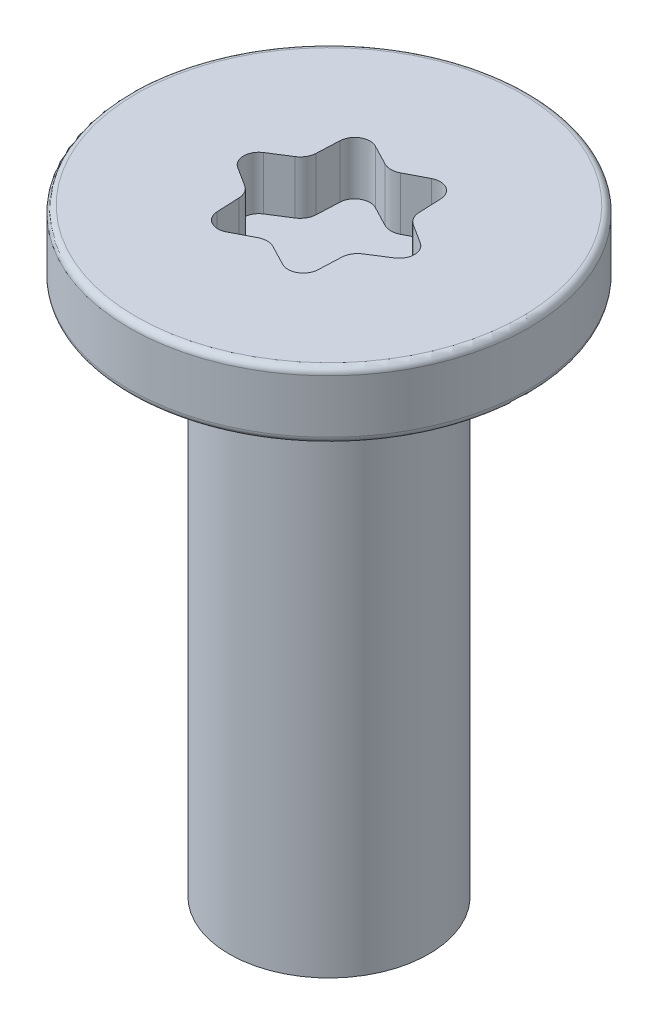
ISO-10303-21;
HEADER;
FILE_DESCRIPTION(('STEP AP214'),'2;1');
FILE_NAME('part.step','',(''),(''),'','','');
FILE_SCHEMA(('AUTOMOTIVE_DESIGN { 1 0 10303 214 1 1 1 1 }'));
ENDSEC;
DATA;
#1=APPLICATION_CONTEXT('core data for automotive mechanical design processes');
#2=APPLICATION_PROTOCOL_DEFINITION('international standard','automotive_design',2000,#1);
#3=PRODUCT_CONTEXT('',#1,'mechanical');
#4=PRODUCT('Part','Part','',(#3));
#5=PRODUCT_RELATED_PRODUCT_CATEGORY('part','',(#4));
#6=PRODUCT_DEFINITION_FORMATION('','',#4);
#7=PRODUCT_DEFINITION_CONTEXT('part definition',#1,'design');
#8=PRODUCT_DEFINITION('design','',#6,#7);
#9=PRODUCT_DEFINITION_SHAPE('','',#8);
#10=(LENGTH_UNIT() NAMED_UNIT(*) SI_UNIT(.MILLI.,.METRE.));
#11=(NAMED_UNIT(*) PLANE_ANGLE_UNIT() SI_UNIT($,.RADIAN.));
#12=(NAMED_UNIT(*) SI_UNIT($,.STERADIAN.) SOLID_ANGLE_UNIT());
#13=UNCERTAINTY_MEASURE_WITH_UNIT(LENGTH_MEASURE(1.E-05),#10,'distance_accuracy_value','');
#14=(GEOMETRIC_REPRESENTATION_CONTEXT(3) GLOBAL_UNCERTAINTY_ASSIGNED_CONTEXT((#13)) GLOBAL_UNIT_ASSIGNED_CONTEXT((#10,
#11,#12)) REPRESENTATION_CONTEXT('',''));
#15=CARTESIAN_POINT('',(0.,0.,0.));
#16=DIRECTION('',(0.,0.,1.));
#17=DIRECTION('',(1.,0.,0.));
#18=AXIS2_PLACEMENT_3D('',#15,#16,#17);
#19=CARTESIAN_POINT('',(0.,0.,-3.));
#20=DIRECTION('',(0.,1.,0.));
#21=DIRECTION('',(0.,0.,1.));
#22=AXIS2_PLACEMENT_3D('',#19,#20,#21);
#23=PLANE('',#22);
#24=DIRECTION('',(0.886771927670818,0.,-0.462207256861012));
#25=VECTOR('',#24,1.);
#26=CARTESIAN_POINT('',(0.368097641561843,0.,0.70621707109422));
#27=LINE('',#26,#25);
#28=CARTESIAN_POINT('',(-0.421192330921968,0.,1.11761434435688));
#29=VERTEX_POINT('',#28);
#30=CARTESIAN_POINT('',(-0.115551814215254,0.,0.958307018082299));
#31=VERTEX_POINT('',#30);
#32=EDGE_CURVE('E56',#29,#31,#27,.T.);
#33=ORIENTED_EDGE('',*,*,#32,.F.);
#34=CARTESIAN_POINT('',(-0.527500000000004,0.,0.913656800992583));
#35=DIRECTION('',(0.,1.,0.));
#36=DIRECTION('',(0.,0.,1.));
#37=AXIS2_PLACEMENT_3D('',#34,#35,#36);
#38=CIRCLE('',#37,0.23);
#39=CARTESIAN_POINT('',(-0.757286248385959,0.,0.923570430636043));
#40=VERTEX_POINT('',#39);
#41=EDGE_CURVE('E306',#29,#40,#38,.F.);
#42=ORIENTED_EDGE('',*,*,#41,.T.);
#43=DIRECTION('',(-0.0431027375802605,0.,-0.999070645156331));
#44=VECTOR('',#43,1.);
#45=CARTESIAN_POINT('',(-0.79565074493476,0.,0.0343266268814208));
#46=LINE('',#45,#44);
#47=CARTESIAN_POINT('',(-0.772142315176557,0.,0.579224315604938));
#48=VERTEX_POINT('',#47);
#49=EDGE_CURVE('E308',#40,#48,#46,.T.);
#50=ORIENTED_EDGE('',*,*,#49,.T.);
#51=CARTESIAN_POINT('',(-1.02190997646564,0.,0.590000000000003));
#52=DIRECTION('',(0.,1.,0.));
#53=DIRECTION('',(0.,0.,1.));
#54=AXIS2_PLACEMENT_3D('',#51,#52,#53);
#55=CIRCLE('',#54,0.25);
#56=CARTESIAN_POINT('',(-0.887694129391809,0.,0.379082702477362));
#57=VERTEX_POINT('',#56);
#58=EDGE_CURVE('E230',#48,#57,#55,.T.);
#59=ORIENTED_EDGE('',*,*,#58,.T.);
#60=DIRECTION('',(0.843669190090564,0.,0.53686338829532));
#61=VECTOR('',#60,1.);
#62=CARTESIAN_POINT('',(-0.427553103372915,0.,0.671890444212806));
#63=LINE('',#62,#61);
#64=CARTESIAN_POINT('',(-1.17847857930793,0.,0.194043913720836));
#65=VERTEX_POINT('',#64);
#66=EDGE_CURVE('E305',#65,#57,#63,.T.);
#67=ORIENTED_EDGE('',*,*,#66,.F.);
#68=CARTESIAN_POINT('',(-1.055,0.,0.));
#69=DIRECTION('',(0.,1.,0.));
#70=DIRECTION('',(0.,0.,1.));
#71=AXIS2_PLACEMENT_3D('',#68,#69,#70);
#72=CIRCLE('',#71,0.23);
#73=CARTESIAN_POINT('',(-1.17847857930792,0.,-0.194043913720829));
#74=VERTEX_POINT('',#73);
#75=EDGE_CURVE('E296',#65,#74,#72,.F.);
#76=ORIENTED_EDGE('',*,*,#75,.T.);
#77=DIRECTION('',(0.843669190090561,0.,-0.536863388295325));
#78=VECTOR('',#77,1.);
#79=CARTESIAN_POINT('',(-0.427553103372918,0.,-0.671890444212802));
#80=LINE('',#79,#78);
#81=CARTESIAN_POINT('',(-0.887694129391808,0.,-0.379082702477357));
#82=VERTEX_POINT('',#81);
#83=EDGE_CURVE('E297',#74,#82,#80,.T.);
#84=ORIENTED_EDGE('',*,*,#83,.T.);
#85=CARTESIAN_POINT('',(-1.02190997646564,0.,-0.589999999999998));
#86=DIRECTION('',(0.,1.,0.));
#87=DIRECTION('',(0.,0.,1.));
#88=AXIS2_PLACEMENT_3D('',#85,#86,#87);
#89=CIRCLE('',#88,0.25);
#90=CARTESIAN_POINT('',(-0.772142315176556,0.,-0.579224315604934));
#91=VERTEX_POINT('',#90);
#92=EDGE_CURVE('E291',#82,#91,#89,.T.);
#93=ORIENTED_EDGE('',*,*,#92,.T.);
#94=DIRECTION('',(-0.0431027375802552,0.,0.999070645156331));
#95=VECTOR('',#94,1.);
#96=CARTESIAN_POINT('',(-0.795650744934757,0.,-0.0343266268814164));
#97=LINE('',#96,#95);
#98=CARTESIAN_POINT('',(-0.757286248385961,0.,-0.923570430636039));
#99=VERTEX_POINT('',#98);
#100=EDGE_CURVE('E287',#99,#91,#97,.T.);
#101=ORIENTED_EDGE('',*,*,#100,.F.);
#102=CARTESIAN_POINT('',(-0.527499999999998,0.,-0.91365680099258));
#103=DIRECTION('',(0.,1.,0.));
#104=DIRECTION('',(0.,0.,1.));
#105=AXIS2_PLACEMENT_3D('',#102,#103,#104);
#106=CIRCLE('',#105,0.23);
#107=CARTESIAN_POINT('',(-0.421192330921967,0.,-1.11761434435687));
#108=VERTEX_POINT('',#107);
#109=EDGE_CURVE('E290',#99,#108,#106,.F.);
#110=ORIENTED_EDGE('',*,*,#109,.T.);
#111=DIRECTION('',(0.886771927670821,0.,0.462207256861006));
#112=VECTOR('',#111,1.);
#113=CARTESIAN_POINT('',(0.368097641561837,0.,-0.70621707109422));
#114=LINE('',#113,#112);
#115=CARTESIAN_POINT('',(-0.115551814215252,0.,-0.958307018082292));
#116=VERTEX_POINT('',#115);
#117=EDGE_CURVE('E281',#108,#116,#114,.T.);
#118=ORIENTED_EDGE('',*,*,#117,.T.);
#119=CARTESIAN_POINT('',(0.,0.,-1.18));
#120=DIRECTION('',(0.,1.,0.));
#121=DIRECTION('',(0.,0.,1.));
#122=AXIS2_PLACEMENT_3D('',#119,#120,#121);
#123=CIRCLE('',#122,0.25);
#124=CARTESIAN_POINT('',(0.115551814215252,0.,-0.958307018082292));
#125=VERTEX_POINT('',#124);
#126=EDGE_CURVE('E282',#116,#125,#123,.T.);
#127=ORIENTED_EDGE('',*,*,#126,.T.);
#128=DIRECTION('',(-0.886771927670819,0.,0.46220725686101));
#129=VECTOR('',#128,1.);
#130=CARTESIAN_POINT('',(-0.36809764156184,0.,-0.706217071094217));
#131=LINE('',#130,#129);
#132=CARTESIAN_POINT('',(0.421192330921965,0.,-1.11761434435687));
#133=VERTEX_POINT('',#132);
#134=EDGE_CURVE('E279',#133,#125,#131,.T.);
#135=ORIENTED_EDGE('',*,*,#134,.F.);
#136=CARTESIAN_POINT('',(0.5275,0.,-0.913656800992577));
#137=DIRECTION('',(0.,1.,0.));
#138=DIRECTION('',(0.,0.,1.));
#139=AXIS2_PLACEMENT_3D('',#136,#137,#138);
#140=CIRCLE('',#139,0.23);
#141=CARTESIAN_POINT('',(0.757286248385956,0.,-0.923570430636036));
#142=VERTEX_POINT('',#141);
#143=EDGE_CURVE('E274',#133,#142,#140,.F.);
#144=ORIENTED_EDGE('',*,*,#143,.T.);
#145=DIRECTION('',(0.0431027375802599,0.,0.999070645156331));
#146=VECTOR('',#145,1.);
#147=CARTESIAN_POINT('',(0.795650744934756,0.,-0.0343266268814201));
#148=LINE('',#147,#146);
#149=CARTESIAN_POINT('',(0.772142315176554,0.,-0.579224315604931));
#150=VERTEX_POINT('',#149);
#151=EDGE_CURVE('E275',#142,#150,#148,.T.);
#152=ORIENTED_EDGE('',*,*,#151,.T.);
#153=CARTESIAN_POINT('',(1.02190997646564,0.,-0.589999999999997));
#154=DIRECTION('',(0.,1.,0.));
#155=DIRECTION('',(0.,0.,1.));
#156=AXIS2_PLACEMENT_3D('',#153,#154,#155);
#157=CIRCLE('',#156,0.25);
#158=CARTESIAN_POINT('',(0.887694129391806,0.,-0.379082702477356));
#159=VERTEX_POINT('',#158);
#160=EDGE_CURVE('E267',#150,#159,#157,.T.);
#161=ORIENTED_EDGE('',*,*,#160,.T.);
#162=DIRECTION('',(-0.843669190090564,0.,-0.53686338829532));
#163=VECTOR('',#162,1.);
#164=CARTESIAN_POINT('',(0.427553103372911,0.,-0.6718904442128));
#165=LINE('',#164,#163);
#166=CARTESIAN_POINT('',(1.17847857930792,0.,-0.194043913720829));
#167=VERTEX_POINT('',#166);
#168=EDGE_CURVE('E266',#167,#159,#165,.T.);
#169=ORIENTED_EDGE('',*,*,#168,.F.);
#170=CARTESIAN_POINT('',(1.055,0.,0.));
#171=DIRECTION('',(0.,1.,0.));
#172=DIRECTION('',(0.,0.,1.));
#173=AXIS2_PLACEMENT_3D('',#170,#171,#172);
#174=CIRCLE('',#173,0.23);
#175=CARTESIAN_POINT('',(1.17847857930792,0.,0.194043913720835));
#176=VERTEX_POINT('',#175);
#177=EDGE_CURVE('E263',#167,#176,#174,.F.);
#178=ORIENTED_EDGE('',*,*,#177,.T.);
#179=DIRECTION('',(-0.843669190090561,0.,0.536863388295325));
#180=VECTOR('',#179,1.);
#181=CARTESIAN_POINT('',(0.42755310337292,0.,0.671890444212805));
#182=LINE('',#181,#180);
#183=CARTESIAN_POINT('',(0.887694129391805,0.,0.379082702477364));
#184=VERTEX_POINT('',#183);
#185=EDGE_CURVE('E257',#176,#184,#182,.T.);
#186=ORIENTED_EDGE('',*,*,#185,.T.);
#187=CARTESIAN_POINT('',(1.02190997646564,0.,0.590000000000004));
#188=DIRECTION('',(0.,1.,0.));
#189=DIRECTION('',(0.,0.,1.));
#190=AXIS2_PLACEMENT_3D('',#187,#188,#189);
#191=CIRCLE('',#190,0.25);
#192=CARTESIAN_POINT('',(0.772142315176553,0.,0.57922431560494));
#193=VERTEX_POINT('',#192);
#194=EDGE_CURVE('E260',#184,#193,#191,.T.);
#195=ORIENTED_EDGE('',*,*,#194,.T.);
#196=DIRECTION('',(0.0431027375802548,0.,-0.999070645156331));
#197=VECTOR('',#196,1.);
#198=CARTESIAN_POINT('',(0.795650744934753,0.,0.034326626881416));
#199=LINE('',#198,#197);
#200=CARTESIAN_POINT('',(0.757286248385957,0.,0.923570430636045));
#201=VERTEX_POINT('',#200);
#202=EDGE_CURVE('E255',#201,#193,#199,.T.);
#203=ORIENTED_EDGE('',*,*,#202,.F.);
#204=CARTESIAN_POINT('',(0.527499999999995,0.,0.913656800992586));
#205=DIRECTION('',(0.,1.,0.));
#206=DIRECTION('',(0.,0.,1.));
#207=AXIS2_PLACEMENT_3D('',#204,#205,#206);
#208=CIRCLE('',#207,0.23);
#209=CARTESIAN_POINT('',(0.421192330921964,0.,1.11761434435687));
#210=VERTEX_POINT('',#209);
#211=EDGE_CURVE('E253',#201,#210,#208,.F.);
#212=ORIENTED_EDGE('',*,*,#211,.T.);
#213=DIRECTION('',(-0.886771927670822,0.,-0.462207256861005));
#214=VECTOR('',#213,1.);
#215=CARTESIAN_POINT('',(-0.36809764156184,0.,0.706217071094227));
#216=LINE('',#215,#214);
#217=CARTESIAN_POINT('',(0.11555181421525,0.,0.958307018082298));
#218=VERTEX_POINT('',#217);
#219=EDGE_CURVE('E246',#210,#218,#216,.T.);
#220=ORIENTED_EDGE('',*,*,#219,.T.);
#221=CARTESIAN_POINT('',(0.,0.,1.18));
#222=DIRECTION('',(0.,1.,0.));
#223=DIRECTION('',(0.,0.,1.));
#224=AXIS2_PLACEMENT_3D('',#221,#222,#223);
#225=CIRCLE('',#224,0.25);
#226=EDGE_CURVE('E243',#218,#31,#225,.T.);
#227=ORIENTED_EDGE('',*,*,#226,.T.);
#228=EDGE_LOOP('',(#33,#42,#50,#59,#67,#76,#84,#93,#101,#110,#118,#127,#135,#144,#152,#161,#169,
#178,#186,#195,#203,#212,#220,#227));
#229=FACE_BOUND('',#228,.T.);
#230=CARTESIAN_POINT('',(0.,0.,0.));
#231=DIRECTION('',(0.,1.,0.));
#232=DIRECTION('',(0.,0.,1.));
#233=AXIS2_PLACEMENT_3D('',#230,#231,#232);
#234=CIRCLE('',#233,2.9);
#235=CARTESIAN_POINT('',(0.,0.,2.9));
#236=VERTEX_POINT('',#235);
#237=EDGE_CURVE('E11',#236,#236,#234,.T.);
#238=ORIENTED_EDGE('',*,*,#237,.T.);
#239=EDGE_LOOP('',(#238));
#240=FACE_BOUND('',#239,.T.);
#241=ADVANCED_FACE('F43',(#229,#240),#23,.T.);
#242=CARTESIAN_POINT('',(0.,-9.,0.));
#243=DIRECTION('',(0.,-1.,0.));
#244=DIRECTION('',(0.,0.,-1.));
#245=AXIS2_PLACEMENT_3D('',#242,#243,#244);
#246=PLANE('',#245);
#247=CARTESIAN_POINT('',(0.,-9.,0.));
#248=DIRECTION('',(0.,-1.,0.));
#249=DIRECTION('',(0.,0.,-1.));
#250=AXIS2_PLACEMENT_3D('',#247,#248,#249);
#251=CIRCLE('',#250,1.5);
#252=CARTESIAN_POINT('',(0.,-9.,-1.5));
#253=VERTEX_POINT('',#252);
#254=EDGE_CURVE('E360',#253,#253,#251,.T.);
#255=ORIENTED_EDGE('',*,*,#254,.T.);
#256=EDGE_LOOP('',(#255));
#257=FACE_BOUND('',#256,.T.);
#258=ADVANCED_FACE('F389',(#257),#246,.T.);
#259=CARTESIAN_POINT('',(0.,0.,0.));
#260=DIRECTION('',(0.,-1.,0.));
#261=DIRECTION('',(0.,0.,-1.));
#262=AXIS2_PLACEMENT_3D('',#259,#260,#261);
#263=CYLINDRICAL_SURFACE('',#262,1.5);
#264=CARTESIAN_POINT('',(0.,-1.,0.));
#265=DIRECTION('',(0.,-1.,0.));
#266=DIRECTION('',(0.,0.,-1.));
#267=AXIS2_PLACEMENT_3D('',#264,#265,#266);
#268=CIRCLE('',#267,1.5);
#269=CARTESIAN_POINT('',(0.,-1.,-1.5));
#270=VERTEX_POINT('',#269);
#271=EDGE_CURVE('E311',#270,#270,#268,.T.);
#272=ORIENTED_EDGE('',*,*,#271,.T.);
#273=EDGE_LOOP('',(#272));
#274=FACE_BOUND('',#273,.T.);
#275=ORIENTED_EDGE('',*,*,#254,.F.);
#276=EDGE_LOOP('',(#275));
#277=FACE_BOUND('',#276,.T.);
#278=ADVANCED_FACE('F385',(#274,#277),#263,.T.);
#279=CARTESIAN_POINT('',(0.,-1.,-1.5));
#280=DIRECTION('',(0.,-1.,0.));
#281=DIRECTION('',(0.,0.,-1.));
#282=AXIS2_PLACEMENT_3D('',#279,#280,#281);
#283=PLANE('',#282);
#284=CARTESIAN_POINT('',(0.,-1.,0.));
#285=DIRECTION('',(0.,-1.,0.));
#286=DIRECTION('',(0.,0.,-1.));
#287=AXIS2_PLACEMENT_3D('',#284,#285,#286);
#288=CIRCLE('',#287,2.9);
#289=CARTESIAN_POINT('',(0.,-1.,-2.9));
#290=VERTEX_POINT('',#289);
#291=EDGE_CURVE('E357',#290,#290,#288,.T.);
#292=ORIENTED_EDGE('',*,*,#291,.T.);
#293=EDGE_LOOP('',(#292));
#294=FACE_BOUND('',#293,.T.);
#295=ORIENTED_EDGE('',*,*,#271,.F.);
#296=EDGE_LOOP('',(#295));
#297=FACE_BOUND('',#296,.T.);
#298=ADVANCED_FACE('F377',(#294,#297),#283,.T.);
#299=CARTESIAN_POINT('',(0.,0.,0.));
#300=DIRECTION('',(0.,-1.,0.));
#301=DIRECTION('',(0.,0.,-1.));
#302=AXIS2_PLACEMENT_3D('',#299,#300,#301);
#303=CYLINDRICAL_SURFACE('',#302,3.);
#304=CARTESIAN_POINT('',(0.,-0.9,0.));
#305=DIRECTION('',(0.,-1.,0.));
#306=DIRECTION('',(0.,0.,-1.));
#307=AXIS2_PLACEMENT_3D('',#304,#305,#306);
#308=CIRCLE('',#307,3.);
#309=CARTESIAN_POINT('',(0.,-0.9,-3.));
#310=VERTEX_POINT('',#309);
#311=EDGE_CURVE('E55',#310,#310,#308,.F.);
#312=ORIENTED_EDGE('',*,*,#311,.T.);
#313=EDGE_LOOP('',(#312));
#314=FACE_BOUND('',#313,.T.);
#315=CARTESIAN_POINT('',(0.,-0.1,0.));
#316=DIRECTION('',(0.,1.,0.));
#317=DIRECTION('',(0.,0.,1.));
#318=AXIS2_PLACEMENT_3D('',#315,#316,#317);
#319=CIRCLE('',#318,3.);
#320=CARTESIAN_POINT('',(0.,-0.1,3.));
#321=VERTEX_POINT('',#320);
#322=EDGE_CURVE('E365',#321,#321,#319,.F.);
#323=ORIENTED_EDGE('',*,*,#322,.T.);
#324=EDGE_LOOP('',(#323));
#325=FACE_BOUND('',#324,.T.);
#326=ADVANCED_FACE('F371',(#314,#325),#303,.T.);
#327=CARTESIAN_POINT('',(0.,-0.9,0.));
#328=DIRECTION('',(0.,-1.,0.));
#329=DIRECTION('',(0.,0.,-1.));
#330=AXIS2_PLACEMENT_3D('',#327,#328,#329);
#331=TOROIDAL_SURFACE('',#330,2.9,0.1);
#332=ORIENTED_EDGE('',*,*,#311,.F.);
#333=EDGE_LOOP('',(#332));
#334=FACE_BOUND('',#333,.T.);
#335=ORIENTED_EDGE('',*,*,#291,.F.);
#336=EDGE_LOOP('',(#335));
#337=FACE_BOUND('',#336,.T.);
#338=ADVANCED_FACE('F372',(#334,#337),#331,.T.);
#339=CARTESIAN_POINT('',(0.,-0.1,0.));
#340=DIRECTION('',(0.,1.,0.));
#341=DIRECTION('',(0.,0.,1.));
#342=AXIS2_PLACEMENT_3D('',#339,#340,#341);
#343=TOROIDAL_SURFACE('',#342,2.9,0.1);
#344=ORIENTED_EDGE('',*,*,#237,.F.);
#345=EDGE_LOOP('',(#344));
#346=FACE_BOUND('',#345,.T.);
#347=ORIENTED_EDGE('',*,*,#322,.F.);
#348=EDGE_LOOP('',(#347));
#349=FACE_BOUND('',#348,.T.);
#350=ADVANCED_FACE('F44',(#346,#349),#343,.T.);
#351=CARTESIAN_POINT('',(0.368097641561843,-0.8,0.70621707109422));
#352=DIRECTION('',(0.462207256861011,0.,0.886771927670818));
#353=DIRECTION('',(0.886771927670818,0.,-0.462207256861011));
#354=AXIS2_PLACEMENT_3D('',#351,#352,#353);
#355=PLANE('',#354);
#356=ORIENTED_EDGE('',*,*,#32,.T.);
#357=DIRECTION('',(0.,1.,0.));
#358=VECTOR('',#357,1.);
#359=CARTESIAN_POINT('',(-0.115551814215254,-0.8,0.958307018082299));
#360=LINE('',#359,#358);
#361=CARTESIAN_POINT('',(-0.115551814215254,-0.8,0.958307018082299));
#362=VERTEX_POINT('',#361);
#363=EDGE_CURVE('E244',#362,#31,#360,.T.);
#364=ORIENTED_EDGE('',*,*,#363,.F.);
#365=DIRECTION('',(0.886771927670818,0.,-0.462207256861012));
#366=VECTOR('',#365,1.);
#367=CARTESIAN_POINT('',(0.368097641561843,-0.8,0.70621707109422));
#368=LINE('',#367,#366);
#369=CARTESIAN_POINT('',(-0.421192330921968,-0.8,1.11761434435688));
#370=VERTEX_POINT('',#369);
#371=EDGE_CURVE('E313',#370,#362,#368,.T.);
#372=ORIENTED_EDGE('',*,*,#371,.F.);
#373=DIRECTION('',(0.,1.,0.));
#374=VECTOR('',#373,1.);
#375=CARTESIAN_POINT('',(-0.421192330921968,-0.8,1.11761434435688));
#376=LINE('',#375,#374);
#377=EDGE_CURVE('E70',#370,#29,#376,.T.);
#378=ORIENTED_EDGE('',*,*,#377,.T.);
#379=EDGE_LOOP('',(#356,#364,#372,#378));
#380=FACE_BOUND('',#379,.T.);
#381=ADVANCED_FACE('F405',(#380),#355,.F.);
#382=CARTESIAN_POINT('',(-0.527500000000004,-0.8,0.913656800992583));
#383=DIRECTION('',(0.,1.,0.));
#384=DIRECTION('',(0.,0.,1.));
#385=AXIS2_PLACEMENT_3D('',#382,#383,#384);
#386=CYLINDRICAL_SURFACE('',#385,0.23);
#387=ORIENTED_EDGE('',*,*,#41,.F.);
#388=ORIENTED_EDGE('',*,*,#377,.F.);
#389=CARTESIAN_POINT('',(-0.527500000000004,-0.8,0.913656800992583));
#390=DIRECTION('',(0.,1.,0.));
#391=DIRECTION('',(0.,0.,1.));
#392=AXIS2_PLACEMENT_3D('',#389,#390,#391);
#393=CIRCLE('',#392,0.23);
#394=CARTESIAN_POINT('',(-0.757286248385959,-0.8,0.923570430636043));
#395=VERTEX_POINT('',#394);
#396=EDGE_CURVE('E219',#370,#395,#393,.F.);
#397=ORIENTED_EDGE('',*,*,#396,.T.);
#398=DIRECTION('',(0.,1.,0.));
#399=VECTOR('',#398,1.);
#400=CARTESIAN_POINT('',(-0.757286248385959,-0.8,0.923570430636043));
#401=LINE('',#400,#399);
#402=EDGE_CURVE('E220',#395,#40,#401,.T.);
#403=ORIENTED_EDGE('',*,*,#402,.T.);
#404=EDGE_LOOP('',(#387,#388,#397,#403));
#405=FACE_BOUND('',#404,.T.);
#406=ADVANCED_FACE('F403',(#405),#386,.F.);
#407=CARTESIAN_POINT('',(-0.79565074493476,-0.8,0.0343266268814208));
#408=DIRECTION('',(0.999070645156331,0.,-0.0431027375802605));
#409=DIRECTION('',(-0.0431027375802605,0.,-0.999070645156331));
#410=AXIS2_PLACEMENT_3D('',#407,#408,#409);
#411=PLANE('',#410);
#412=ORIENTED_EDGE('',*,*,#49,.F.);
#413=ORIENTED_EDGE('',*,*,#402,.F.);
#414=DIRECTION('',(-0.0431027375802605,0.,-0.999070645156331));
#415=VECTOR('',#414,1.);
#416=CARTESIAN_POINT('',(-0.79565074493476,-0.8,0.0343266268814208));
#417=LINE('',#416,#415);
#418=CARTESIAN_POINT('',(-0.772142315176557,-0.8,0.579224315604938));
#419=VERTEX_POINT('',#418);
#420=EDGE_CURVE('E211',#395,#419,#417,.T.);
#421=ORIENTED_EDGE('',*,*,#420,.T.);
#422=DIRECTION('',(0.,1.,0.));
#423=VECTOR('',#422,1.);
#424=CARTESIAN_POINT('',(-0.772142315176557,-0.8,0.579224315604938));
#425=LINE('',#424,#423);
#426=EDGE_CURVE('E214',#419,#48,#425,.T.);
#427=ORIENTED_EDGE('',*,*,#426,.T.);
#428=EDGE_LOOP('',(#412,#413,#421,#427));
#429=FACE_BOUND('',#428,.T.);
#430=ADVANCED_FACE('F212',(#429),#411,.T.);
#431=CARTESIAN_POINT('',(-1.02190997646564,-0.8,0.590000000000003));
#432=DIRECTION('',(0.,1.,0.));
#433=DIRECTION('',(0.,0.,1.));
#434=AXIS2_PLACEMENT_3D('',#431,#432,#433);
#435=CYLINDRICAL_SURFACE('',#434,0.25);
#436=ORIENTED_EDGE('',*,*,#58,.F.);
#437=ORIENTED_EDGE('',*,*,#426,.F.);
#438=CARTESIAN_POINT('',(-1.02190997646564,-0.8,0.590000000000003));
#439=DIRECTION('',(0.,1.,0.));
#440=DIRECTION('',(0.,0.,1.));
#441=AXIS2_PLACEMENT_3D('',#438,#439,#440);
#442=CIRCLE('',#441,0.25);
#443=CARTESIAN_POINT('',(-0.887694129391809,-0.8,0.379082702477362));
#444=VERTEX_POINT('',#443);
#445=EDGE_CURVE('E222',#419,#444,#442,.T.);
#446=ORIENTED_EDGE('',*,*,#445,.T.);
#447=DIRECTION('',(0.,1.,0.));
#448=VECTOR('',#447,1.);
#449=CARTESIAN_POINT('',(-0.887694129391809,-0.8,0.379082702477362));
#450=LINE('',#449,#448);
#451=EDGE_CURVE('E226',#444,#57,#450,.T.);
#452=ORIENTED_EDGE('',*,*,#451,.T.);
#453=EDGE_LOOP('',(#436,#437,#446,#452));
#454=FACE_BOUND('',#453,.T.);
#455=ADVANCED_FACE('F221',(#454),#435,.T.);
#456=CARTESIAN_POINT('',(-0.427553103372915,-0.8,0.671890444212806));
#457=DIRECTION('',(-0.53686338829532,0.,0.843669190090565));
#458=DIRECTION('',(0.843669190090565,0.,0.53686338829532));
#459=AXIS2_PLACEMENT_3D('',#456,#457,#458);
#460=PLANE('',#459);
#461=ORIENTED_EDGE('',*,*,#66,.T.);
#462=ORIENTED_EDGE('',*,*,#451,.F.);
#463=DIRECTION('',(0.843669190090564,0.,0.53686338829532));
#464=VECTOR('',#463,1.);
#465=CARTESIAN_POINT('',(-0.427553103372915,-0.8,0.671890444212806));
#466=LINE('',#465,#464);
#467=CARTESIAN_POINT('',(-1.17847857930793,-0.8,0.194043913720836));
#468=VERTEX_POINT('',#467);
#469=EDGE_CURVE('E237',#468,#444,#466,.T.);
#470=ORIENTED_EDGE('',*,*,#469,.F.);
#471=DIRECTION('',(0.,1.,0.));
#472=VECTOR('',#471,1.);
#473=CARTESIAN_POINT('',(-1.17847857930793,-0.8,0.194043913720836));
#474=LINE('',#473,#472);
#475=EDGE_CURVE('E316',#468,#65,#474,.T.);
#476=ORIENTED_EDGE('',*,*,#475,.T.);
#477=EDGE_LOOP('',(#461,#462,#470,#476));
#478=FACE_BOUND('',#477,.T.);
#479=ADVANCED_FACE('F477',(#478),#460,.F.);
#480=CARTESIAN_POINT('',(-1.055,-0.8,0.));
#481=DIRECTION('',(0.,1.,0.));
#482=DIRECTION('',(0.,0.,1.));
#483=AXIS2_PLACEMENT_3D('',#480,#481,#482);
#484=CYLINDRICAL_SURFACE('',#483,0.23);
#485=ORIENTED_EDGE('',*,*,#75,.F.);
#486=ORIENTED_EDGE('',*,*,#475,.F.);
#487=CARTESIAN_POINT('',(-1.055,-0.8,0.));
#488=DIRECTION('',(0.,1.,0.));
#489=DIRECTION('',(0.,0.,1.));
#490=AXIS2_PLACEMENT_3D('',#487,#488,#489);
#491=CIRCLE('',#490,0.23);
#492=CARTESIAN_POINT('',(-1.17847857930792,-0.8,-0.194043913720829));
#493=VERTEX_POINT('',#492);
#494=EDGE_CURVE('E236',#468,#493,#491,.F.);
#495=ORIENTED_EDGE('',*,*,#494,.T.);
#496=DIRECTION('',(0.,1.,0.));
#497=VECTOR('',#496,1.);
#498=CARTESIAN_POINT('',(-1.17847857930792,-0.8,-0.194043913720829));
#499=LINE('',#498,#497);
#500=EDGE_CURVE('E318',#493,#74,#499,.T.);
#501=ORIENTED_EDGE('',*,*,#500,.T.);
#502=EDGE_LOOP('',(#485,#486,#495,#501));
#503=FACE_BOUND('',#502,.T.);
#504=ADVANCED_FACE('F478',(#503),#484,.F.);
#505=CARTESIAN_POINT('',(-0.427553103372918,-0.8,-0.671890444212802));
#506=DIRECTION('',(0.536863388295325,0.,0.843669190090561));
#507=DIRECTION('',(0.843669190090561,0.,-0.536863388295325));
#508=AXIS2_PLACEMENT_3D('',#505,#506,#507);
#509=PLANE('',#508);
#510=ORIENTED_EDGE('',*,*,#83,.F.);
#511=ORIENTED_EDGE('',*,*,#500,.F.);
#512=DIRECTION('',(0.843669190090561,0.,-0.536863388295325));
#513=VECTOR('',#512,1.);
#514=CARTESIAN_POINT('',(-0.427553103372918,-0.8,-0.671890444212802));
#515=LINE('',#514,#513);
#516=CARTESIAN_POINT('',(-0.887694129391808,-0.8,-0.379082702477357));
#517=VERTEX_POINT('',#516);
#518=EDGE_CURVE('E766',#493,#517,#515,.T.);
#519=ORIENTED_EDGE('',*,*,#518,.T.);
#520=DIRECTION('',(0.,1.,0.));
#521=VECTOR('',#520,1.);
#522=CARTESIAN_POINT('',(-0.887694129391808,-0.8,-0.379082702477357));
#523=LINE('',#522,#521);
#524=EDGE_CURVE('E319',#517,#82,#523,.T.);
#525=ORIENTED_EDGE('',*,*,#524,.T.);
#526=EDGE_LOOP('',(#510,#511,#519,#525));
#527=FACE_BOUND('',#526,.T.);
#528=ADVANCED_FACE('F472',(#527),#509,.T.);
#529=CARTESIAN_POINT('',(-1.02190997646564,-0.8,-0.589999999999998));
#530=DIRECTION('',(0.,1.,0.));
#531=DIRECTION('',(0.,0.,1.));
#532=AXIS2_PLACEMENT_3D('',#529,#530,#531);
#533=CYLINDRICAL_SURFACE('',#532,0.25);
#534=ORIENTED_EDGE('',*,*,#92,.F.);
#535=ORIENTED_EDGE('',*,*,#524,.F.);
#536=CARTESIAN_POINT('',(-1.02190997646564,-0.8,-0.589999999999998));
#537=DIRECTION('',(0.,1.,0.));
#538=DIRECTION('',(0.,0.,1.));
#539=AXIS2_PLACEMENT_3D('',#536,#537,#538);
#540=CIRCLE('',#539,0.25);
#541=CARTESIAN_POINT('',(-0.772142315176556,-0.8,-0.579224315604934));
#542=VERTEX_POINT('',#541);
#543=EDGE_CURVE('E762',#517,#542,#540,.T.);
#544=ORIENTED_EDGE('',*,*,#543,.T.);
#545=DIRECTION('',(0.,1.,0.));
#546=VECTOR('',#545,1.);
#547=CARTESIAN_POINT('',(-0.772142315176556,-0.8,-0.579224315604934));
#548=LINE('',#547,#546);
#549=EDGE_CURVE('E325',#542,#91,#548,.T.);
#550=ORIENTED_EDGE('',*,*,#549,.T.);
#551=EDGE_LOOP('',(#534,#535,#544,#550));
#552=FACE_BOUND('',#551,.T.);
#553=ADVANCED_FACE('F466',(#552),#533,.T.);
#554=CARTESIAN_POINT('',(-0.795650744934757,-0.8,-0.0343266268814164));
#555=DIRECTION('',(-0.999070645156331,0.,-0.0431027375802552));
#556=DIRECTION('',(-0.0431027375802552,0.,0.999070645156331));
#557=AXIS2_PLACEMENT_3D('',#554,#555,#556);
#558=PLANE('',#557);
#559=ORIENTED_EDGE('',*,*,#100,.T.);
#560=ORIENTED_EDGE('',*,*,#549,.F.);
#561=DIRECTION('',(-0.0431027375802552,0.,0.999070645156331));
#562=VECTOR('',#561,1.);
#563=CARTESIAN_POINT('',(-0.795650744934757,-0.8,-0.0343266268814164));
#564=LINE('',#563,#562);
#565=CARTESIAN_POINT('',(-0.757286248385961,-0.8,-0.923570430636039));
#566=VERTEX_POINT('',#565);
#567=EDGE_CURVE('E761',#566,#542,#564,.T.);
#568=ORIENTED_EDGE('',*,*,#567,.F.);
#569=DIRECTION('',(0.,1.,0.));
#570=VECTOR('',#569,1.);
#571=CARTESIAN_POINT('',(-0.757286248385961,-0.8,-0.923570430636039));
#572=LINE('',#571,#570);
#573=EDGE_CURVE('E322',#566,#99,#572,.T.);
#574=ORIENTED_EDGE('',*,*,#573,.T.);
#575=EDGE_LOOP('',(#559,#560,#568,#574));
#576=FACE_BOUND('',#575,.T.);
#577=ADVANCED_FACE('F461',(#576),#558,.F.);
#578=CARTESIAN_POINT('',(-0.527499999999998,-0.8,-0.91365680099258));
#579=DIRECTION('',(0.,1.,0.));
#580=DIRECTION('',(0.,0.,1.));
#581=AXIS2_PLACEMENT_3D('',#578,#579,#580);
#582=CYLINDRICAL_SURFACE('',#581,0.23);
#583=ORIENTED_EDGE('',*,*,#109,.F.);
#584=ORIENTED_EDGE('',*,*,#573,.F.);
#585=CARTESIAN_POINT('',(-0.527499999999998,-0.8,-0.91365680099258));
#586=DIRECTION('',(0.,1.,0.));
#587=DIRECTION('',(0.,0.,1.));
#588=AXIS2_PLACEMENT_3D('',#585,#586,#587);
#589=CIRCLE('',#588,0.23);
#590=CARTESIAN_POINT('',(-0.421192330921967,-0.8,-1.11761434435687));
#591=VERTEX_POINT('',#590);
#592=EDGE_CURVE('E757',#566,#591,#589,.F.);
#593=ORIENTED_EDGE('',*,*,#592,.T.);
#594=DIRECTION('',(0.,1.,0.));
#595=VECTOR('',#594,1.);
#596=CARTESIAN_POINT('',(-0.421192330921967,-0.8,-1.11761434435687));
#597=LINE('',#596,#595);
#598=EDGE_CURVE('E326',#591,#108,#597,.T.);
#599=ORIENTED_EDGE('',*,*,#598,.T.);
#600=EDGE_LOOP('',(#583,#584,#593,#599));
#601=FACE_BOUND('',#600,.T.);
#602=ADVANCED_FACE('F458',(#601),#582,.F.);
#603=CARTESIAN_POINT('',(0.368097641561837,-0.8,-0.70621707109422));
#604=DIRECTION('',(-0.462207256861006,0.,0.886771927670821));
#605=DIRECTION('',(0.886771927670821,0.,0.462207256861006));
#606=AXIS2_PLACEMENT_3D('',#603,#604,#605);
#607=PLANE('',#606);
#608=ORIENTED_EDGE('',*,*,#117,.F.);
#609=ORIENTED_EDGE('',*,*,#598,.F.);
#610=DIRECTION('',(0.886771927670821,0.,0.462207256861006));
#611=VECTOR('',#610,1.);
#612=CARTESIAN_POINT('',(0.368097641561837,-0.8,-0.70621707109422));
#613=LINE('',#612,#611);
#614=CARTESIAN_POINT('',(-0.115551814215252,-0.8,-0.958307018082292));
#615=VERTEX_POINT('',#614);
#616=EDGE_CURVE('E760',#591,#615,#613,.T.);
#617=ORIENTED_EDGE('',*,*,#616,.T.);
#618=DIRECTION('',(0.,1.,0.));
#619=VECTOR('',#618,1.);
#620=CARTESIAN_POINT('',(-0.115551814215252,-0.8,-0.958307018082292));
#621=LINE('',#620,#619);
#622=EDGE_CURVE('E327',#615,#116,#621,.T.);
#623=ORIENTED_EDGE('',*,*,#622,.T.);
#624=EDGE_LOOP('',(#608,#609,#617,#623));
#625=FACE_BOUND('',#624,.T.);
#626=ADVANCED_FACE('F457',(#625),#607,.T.);
#627=CARTESIAN_POINT('',(0.,-0.8,-1.18));
#628=DIRECTION('',(0.,1.,0.));
#629=DIRECTION('',(0.,0.,1.));
#630=AXIS2_PLACEMENT_3D('',#627,#628,#629);
#631=CYLINDRICAL_SURFACE('',#630,0.25);
#632=ORIENTED_EDGE('',*,*,#126,.F.);
#633=ORIENTED_EDGE('',*,*,#622,.F.);
#634=CARTESIAN_POINT('',(0.,-0.8,-1.18));
#635=DIRECTION('',(0.,1.,0.));
#636=DIRECTION('',(0.,0.,1.));
#637=AXIS2_PLACEMENT_3D('',#634,#635,#636);
#638=CIRCLE('',#637,0.25);
#639=CARTESIAN_POINT('',(0.115551814215252,-0.8,-0.958307018082292));
#640=VERTEX_POINT('',#639);
#641=EDGE_CURVE('E752',#615,#640,#638,.T.);
#642=ORIENTED_EDGE('',*,*,#641,.T.);
#643=DIRECTION('',(0.,1.,0.));
#644=VECTOR('',#643,1.);
#645=CARTESIAN_POINT('',(0.115551814215252,-0.8,-0.958307018082292));
#646=LINE('',#645,#644);
#647=EDGE_CURVE('E329',#640,#125,#646,.T.);
#648=ORIENTED_EDGE('',*,*,#647,.T.);
#649=EDGE_LOOP('',(#632,#633,#642,#648));
#650=FACE_BOUND('',#649,.T.);
#651=ADVANCED_FACE('F455',(#650),#631,.T.);
#652=CARTESIAN_POINT('',(-0.36809764156184,-0.8,-0.706217071094217));
#653=DIRECTION('',(-0.46220725686101,0.,-0.886771927670819));
#654=DIRECTION('',(-0.886771927670819,0.,0.46220725686101));
#655=AXIS2_PLACEMENT_3D('',#652,#653,#654);
#656=PLANE('',#655);
#657=ORIENTED_EDGE('',*,*,#134,.T.);
#658=ORIENTED_EDGE('',*,*,#647,.F.);
#659=DIRECTION('',(-0.886771927670819,0.,0.46220725686101));
#660=VECTOR('',#659,1.);
#661=CARTESIAN_POINT('',(-0.36809764156184,-0.8,-0.706217071094217));
#662=LINE('',#661,#660);
#663=CARTESIAN_POINT('',(0.421192330921965,-0.8,-1.11761434435687));
#664=VERTEX_POINT('',#663);
#665=EDGE_CURVE('E755',#664,#640,#662,.T.);
#666=ORIENTED_EDGE('',*,*,#665,.F.);
#667=DIRECTION('',(0.,1.,0.));
#668=VECTOR('',#667,1.);
#669=CARTESIAN_POINT('',(0.421192330921965,-0.8,-1.11761434435687));
#670=LINE('',#669,#668);
#671=EDGE_CURVE('E335',#664,#133,#670,.T.);
#672=ORIENTED_EDGE('',*,*,#671,.T.);
#673=EDGE_LOOP('',(#657,#658,#666,#672));
#674=FACE_BOUND('',#673,.T.);
#675=ADVANCED_FACE('F449',(#674),#656,.F.);
#676=CARTESIAN_POINT('',(0.5275,-0.8,-0.913656800992577));
#677=DIRECTION('',(0.,1.,0.));
#678=DIRECTION('',(0.,0.,1.));
#679=AXIS2_PLACEMENT_3D('',#676,#677,#678);
#680=CYLINDRICAL_SURFACE('',#679,0.23);
#681=ORIENTED_EDGE('',*,*,#143,.F.);
#682=ORIENTED_EDGE('',*,*,#671,.F.);
#683=CARTESIAN_POINT('',(0.5275,-0.8,-0.913656800992577));
#684=DIRECTION('',(0.,1.,0.));
#685=DIRECTION('',(0.,0.,1.));
#686=AXIS2_PLACEMENT_3D('',#683,#684,#685);
#687=CIRCLE('',#686,0.23);
#688=CARTESIAN_POINT('',(0.757286248385956,-0.8,-0.923570430636036));
#689=VERTEX_POINT('',#688);
#690=EDGE_CURVE('E749',#664,#689,#687,.F.);
#691=ORIENTED_EDGE('',*,*,#690,.T.);
#692=DIRECTION('',(0.,1.,0.));
#693=VECTOR('',#692,1.);
#694=CARTESIAN_POINT('',(0.757286248385956,-0.8,-0.923570430636036));
#695=LINE('',#694,#693);
#696=EDGE_CURVE('E331',#689,#142,#695,.T.);
#697=ORIENTED_EDGE('',*,*,#696,.T.);
#698=EDGE_LOOP('',(#681,#682,#691,#697));
#699=FACE_BOUND('',#698,.T.);
#700=ADVANCED_FACE('F441',(#699),#680,.F.);
#701=CARTESIAN_POINT('',(0.795650744934756,-0.8,-0.0343266268814201));
#702=DIRECTION('',(-0.999070645156331,0.,0.0431027375802599));
#703=DIRECTION('',(0.0431027375802599,0.,0.999070645156331));
#704=AXIS2_PLACEMENT_3D('',#701,#702,#703);
#705=PLANE('',#704);
#706=ORIENTED_EDGE('',*,*,#151,.F.);
#707=ORIENTED_EDGE('',*,*,#696,.F.);
#708=DIRECTION('',(0.0431027375802599,0.,0.999070645156331));
#709=VECTOR('',#708,1.);
#710=CARTESIAN_POINT('',(0.795650744934756,-0.8,-0.0343266268814201));
#711=LINE('',#710,#709);
#712=CARTESIAN_POINT('',(0.772142315176554,-0.8,-0.579224315604931));
#713=VERTEX_POINT('',#712);
#714=EDGE_CURVE('E746',#689,#713,#711,.T.);
#715=ORIENTED_EDGE('',*,*,#714,.T.);
#716=DIRECTION('',(0.,1.,0.));
#717=VECTOR('',#716,1.);
#718=CARTESIAN_POINT('',(0.772142315176554,-0.8,-0.579224315604931));
#719=LINE('',#718,#717);
#720=EDGE_CURVE('E337',#713,#150,#719,.T.);
#721=ORIENTED_EDGE('',*,*,#720,.T.);
#722=EDGE_LOOP('',(#706,#707,#715,#721));
#723=FACE_BOUND('',#722,.T.);
#724=ADVANCED_FACE('F439',(#723),#705,.T.);
#725=CARTESIAN_POINT('',(1.02190997646564,-0.8,-0.589999999999997));
#726=DIRECTION('',(0.,1.,0.));
#727=DIRECTION('',(0.,0.,1.));
#728=AXIS2_PLACEMENT_3D('',#725,#726,#727);
#729=CYLINDRICAL_SURFACE('',#728,0.25);
#730=ORIENTED_EDGE('',*,*,#160,.F.);
#731=ORIENTED_EDGE('',*,*,#720,.F.);
#732=CARTESIAN_POINT('',(1.02190997646564,-0.8,-0.589999999999997));
#733=DIRECTION('',(0.,1.,0.));
#734=DIRECTION('',(0.,0.,1.));
#735=AXIS2_PLACEMENT_3D('',#732,#733,#734);
#736=CIRCLE('',#735,0.25);
#737=CARTESIAN_POINT('',(0.887694129391806,-0.8,-0.379082702477356));
#738=VERTEX_POINT('',#737);
#739=EDGE_CURVE('E748',#713,#738,#736,.T.);
#740=ORIENTED_EDGE('',*,*,#739,.T.);
#741=DIRECTION('',(0.,1.,0.));
#742=VECTOR('',#741,1.);
#743=CARTESIAN_POINT('',(0.887694129391806,-0.8,-0.379082702477356));
#744=LINE('',#743,#742);
#745=EDGE_CURVE('E339',#738,#159,#744,.T.);
#746=ORIENTED_EDGE('',*,*,#745,.T.);
#747=EDGE_LOOP('',(#730,#731,#740,#746));
#748=FACE_BOUND('',#747,.T.);
#749=ADVANCED_FACE('F436',(#748),#729,.T.);
#750=CARTESIAN_POINT('',(0.427553103372911,-0.8,-0.6718904442128));
#751=DIRECTION('',(0.53686338829532,0.,-0.843669190090564));
#752=DIRECTION('',(-0.843669190090564,0.,-0.53686338829532));
#753=AXIS2_PLACEMENT_3D('',#750,#751,#752);
#754=PLANE('',#753);
#755=ORIENTED_EDGE('',*,*,#168,.T.);
#756=ORIENTED_EDGE('',*,*,#745,.F.);
#757=DIRECTION('',(-0.843669190090564,0.,-0.53686338829532));
#758=VECTOR('',#757,1.);
#759=CARTESIAN_POINT('',(0.427553103372911,-0.8,-0.6718904442128));
#760=LINE('',#759,#758);
#761=CARTESIAN_POINT('',(1.17847857930792,-0.8,-0.194043913720829));
#762=VERTEX_POINT('',#761);
#763=EDGE_CURVE('E741',#762,#738,#760,.T.);
#764=ORIENTED_EDGE('',*,*,#763,.F.);
#765=DIRECTION('',(0.,1.,0.));
#766=VECTOR('',#765,1.);
#767=CARTESIAN_POINT('',(1.17847857930792,-0.8,-0.194043913720829));
#768=LINE('',#767,#766);
#769=EDGE_CURVE('E338',#762,#167,#768,.T.);
#770=ORIENTED_EDGE('',*,*,#769,.T.);
#771=EDGE_LOOP('',(#755,#756,#764,#770));
#772=FACE_BOUND('',#771,.T.);
#773=ADVANCED_FACE('F435',(#772),#754,.F.);
#774=CARTESIAN_POINT('',(1.055,-0.8,0.));
#775=DIRECTION('',(0.,1.,0.));
#776=DIRECTION('',(0.,0.,1.));
#777=AXIS2_PLACEMENT_3D('',#774,#775,#776);
#778=CYLINDRICAL_SURFACE('',#777,0.23);
#779=ORIENTED_EDGE('',*,*,#177,.F.);
#780=ORIENTED_EDGE('',*,*,#769,.F.);
#781=CARTESIAN_POINT('',(1.055,-0.8,0.));
#782=DIRECTION('',(0.,1.,0.));
#783=DIRECTION('',(0.,0.,1.));
#784=AXIS2_PLACEMENT_3D('',#781,#782,#783);
#785=CIRCLE('',#784,0.23);
#786=CARTESIAN_POINT('',(1.17847857930792,-0.8,0.194043913720835));
#787=VERTEX_POINT('',#786);
#788=EDGE_CURVE('E743',#762,#787,#785,.F.);
#789=ORIENTED_EDGE('',*,*,#788,.T.);
#790=DIRECTION('',(0.,1.,0.));
#791=VECTOR('',#790,1.);
#792=CARTESIAN_POINT('',(1.17847857930792,-0.8,0.194043913720835));
#793=LINE('',#792,#791);
#794=EDGE_CURVE('E345',#787,#176,#793,.T.);
#795=ORIENTED_EDGE('',*,*,#794,.T.);
#796=EDGE_LOOP('',(#779,#780,#789,#795));
#797=FACE_BOUND('',#796,.T.);
#798=ADVANCED_FACE('F428',(#797),#778,.F.);
#799=CARTESIAN_POINT('',(0.42755310337292,-0.8,0.671890444212805));
#800=DIRECTION('',(-0.536863388295325,0.,-0.843669190090561));
#801=DIRECTION('',(-0.843669190090561,0.,0.536863388295325));
#802=AXIS2_PLACEMENT_3D('',#799,#800,#801);
#803=PLANE('',#802);
#804=ORIENTED_EDGE('',*,*,#185,.F.);
#805=ORIENTED_EDGE('',*,*,#794,.F.);
#806=DIRECTION('',(-0.843669190090561,0.,0.536863388295325));
#807=VECTOR('',#806,1.);
#808=CARTESIAN_POINT('',(0.42755310337292,-0.8,0.671890444212805));
#809=LINE('',#808,#807);
#810=CARTESIAN_POINT('',(0.887694129391805,-0.8,0.379082702477364));
#811=VERTEX_POINT('',#810);
#812=EDGE_CURVE('E736',#787,#811,#809,.T.);
#813=ORIENTED_EDGE('',*,*,#812,.T.);
#814=DIRECTION('',(0.,1.,0.));
#815=VECTOR('',#814,1.);
#816=CARTESIAN_POINT('',(0.887694129391805,-0.8,0.379082702477364));
#817=LINE('',#816,#815);
#818=EDGE_CURVE('E344',#811,#184,#817,.T.);
#819=ORIENTED_EDGE('',*,*,#818,.T.);
#820=EDGE_LOOP('',(#804,#805,#813,#819));
#821=FACE_BOUND('',#820,.T.);
#822=ADVANCED_FACE('F424',(#821),#803,.T.);
#823=CARTESIAN_POINT('',(1.02190997646564,-0.8,0.590000000000004));
#824=DIRECTION('',(0.,1.,0.));
#825=DIRECTION('',(0.,0.,1.));
#826=AXIS2_PLACEMENT_3D('',#823,#824,#825);
#827=CYLINDRICAL_SURFACE('',#826,0.25);
#828=ORIENTED_EDGE('',*,*,#194,.F.);
#829=ORIENTED_EDGE('',*,*,#818,.F.);
#830=CARTESIAN_POINT('',(1.02190997646564,-0.8,0.590000000000004));
#831=DIRECTION('',(0.,1.,0.));
#832=DIRECTION('',(0.,0.,1.));
#833=AXIS2_PLACEMENT_3D('',#830,#831,#832);
#834=CIRCLE('',#833,0.25);
#835=CARTESIAN_POINT('',(0.772142315176553,-0.8,0.57922431560494));
#836=VERTEX_POINT('',#835);
#837=EDGE_CURVE('E740',#811,#836,#834,.T.);
#838=ORIENTED_EDGE('',*,*,#837,.T.);
#839=DIRECTION('',(0.,1.,0.));
#840=VECTOR('',#839,1.);
#841=CARTESIAN_POINT('',(0.772142315176553,-0.8,0.57922431560494));
#842=LINE('',#841,#840);
#843=EDGE_CURVE('E347',#836,#193,#842,.T.);
#844=ORIENTED_EDGE('',*,*,#843,.T.);
#845=EDGE_LOOP('',(#828,#829,#838,#844));
#846=FACE_BOUND('',#845,.T.);
#847=ADVANCED_FACE('F419',(#846),#827,.T.);
#848=CARTESIAN_POINT('',(0.795650744934753,-0.8,0.034326626881416));
#849=DIRECTION('',(0.999070645156331,0.,0.0431027375802548));
#850=DIRECTION('',(0.0431027375802548,0.,-0.999070645156331));
#851=AXIS2_PLACEMENT_3D('',#848,#849,#850);
#852=PLANE('',#851);
#853=ORIENTED_EDGE('',*,*,#202,.T.);
#854=ORIENTED_EDGE('',*,*,#843,.F.);
#855=DIRECTION('',(0.0431027375802548,0.,-0.999070645156331));
#856=VECTOR('',#855,1.);
#857=CARTESIAN_POINT('',(0.795650744934753,-0.8,0.034326626881416));
#858=LINE('',#857,#856);
#859=CARTESIAN_POINT('',(0.757286248385957,-0.8,0.923570430636045));
#860=VERTEX_POINT('',#859);
#861=EDGE_CURVE('E734',#860,#836,#858,.T.);
#862=ORIENTED_EDGE('',*,*,#861,.F.);
#863=DIRECTION('',(0.,1.,0.));
#864=VECTOR('',#863,1.);
#865=CARTESIAN_POINT('',(0.757286248385957,-0.8,0.923570430636045));
#866=LINE('',#865,#864);
#867=EDGE_CURVE('E346',#860,#201,#866,.T.);
#868=ORIENTED_EDGE('',*,*,#867,.T.);
#869=EDGE_LOOP('',(#853,#854,#862,#868));
#870=FACE_BOUND('',#869,.T.);
#871=ADVANCED_FACE('F418',(#870),#852,.F.);
#872=CARTESIAN_POINT('',(0.527499999999995,-0.8,0.913656800992586));
#873=DIRECTION('',(0.,1.,0.));
#874=DIRECTION('',(0.,0.,1.));
#875=AXIS2_PLACEMENT_3D('',#872,#873,#874);
#876=CYLINDRICAL_SURFACE('',#875,0.23);
#877=ORIENTED_EDGE('',*,*,#211,.F.);
#878=ORIENTED_EDGE('',*,*,#867,.F.);
#879=CARTESIAN_POINT('',(0.527499999999995,-0.8,0.913656800992586));
#880=DIRECTION('',(0.,1.,0.));
#881=DIRECTION('',(0.,0.,1.));
#882=AXIS2_PLACEMENT_3D('',#879,#880,#881);
#883=CIRCLE('',#882,0.23);
#884=CARTESIAN_POINT('',(0.421192330921964,-0.8,1.11761434435687));
#885=VERTEX_POINT('',#884);
#886=EDGE_CURVE('E735',#860,#885,#883,.F.);
#887=ORIENTED_EDGE('',*,*,#886,.T.);
#888=DIRECTION('',(0.,1.,0.));
#889=VECTOR('',#888,1.);
#890=CARTESIAN_POINT('',(0.421192330921964,-0.8,1.11761434435687));
#891=LINE('',#890,#889);
#892=EDGE_CURVE('E348',#885,#210,#891,.T.);
#893=ORIENTED_EDGE('',*,*,#892,.T.);
#894=EDGE_LOOP('',(#877,#878,#887,#893));
#895=FACE_BOUND('',#894,.T.);
#896=ADVANCED_FACE('F415',(#895),#876,.F.);
#897=CARTESIAN_POINT('',(-0.36809764156184,-0.8,0.706217071094227));
#898=DIRECTION('',(0.462207256861005,0.,-0.886771927670821));
#899=DIRECTION('',(-0.886771927670822,0.,-0.462207256861005));
#900=AXIS2_PLACEMENT_3D('',#897,#898,#899);
#901=PLANE('',#900);
#902=ORIENTED_EDGE('',*,*,#219,.F.);
#903=ORIENTED_EDGE('',*,*,#892,.F.);
#904=DIRECTION('',(-0.886771927670822,0.,-0.462207256861005));
#905=VECTOR('',#904,1.);
#906=CARTESIAN_POINT('',(-0.36809764156184,-0.8,0.706217071094227));
#907=LINE('',#906,#905);
#908=CARTESIAN_POINT('',(0.11555181421525,-0.8,0.958307018082298));
#909=VERTEX_POINT('',#908);
#910=EDGE_CURVE('E726',#885,#909,#907,.T.);
#911=ORIENTED_EDGE('',*,*,#910,.T.);
#912=DIRECTION('',(0.,1.,0.));
#913=VECTOR('',#912,1.);
#914=CARTESIAN_POINT('',(0.11555181421525,-0.8,0.958307018082298));
#915=LINE('',#914,#913);
#916=EDGE_CURVE('E355',#909,#218,#915,.T.);
#917=ORIENTED_EDGE('',*,*,#916,.T.);
#918=EDGE_LOOP('',(#902,#903,#911,#917));
#919=FACE_BOUND('',#918,.T.);
#920=ADVANCED_FACE('F406',(#919),#901,.T.);
#921=CARTESIAN_POINT('',(0.,-0.8,1.18));
#922=DIRECTION('',(0.,1.,0.));
#923=DIRECTION('',(0.,0.,1.));
#924=AXIS2_PLACEMENT_3D('',#921,#922,#923);
#925=CYLINDRICAL_SURFACE('',#924,0.25);
#926=ORIENTED_EDGE('',*,*,#226,.F.);
#927=ORIENTED_EDGE('',*,*,#916,.F.);
#928=CARTESIAN_POINT('',(0.,-0.8,1.18));
#929=DIRECTION('',(0.,1.,0.));
#930=DIRECTION('',(0.,0.,1.));
#931=AXIS2_PLACEMENT_3D('',#928,#929,#930);
#932=CIRCLE('',#931,0.25);
#933=EDGE_CURVE('E150',#909,#362,#932,.T.);
#934=ORIENTED_EDGE('',*,*,#933,.T.);
#935=ORIENTED_EDGE('',*,*,#363,.T.);
#936=EDGE_LOOP('',(#926,#927,#934,#935));
#937=FACE_BOUND('',#936,.T.);
#938=ADVANCED_FACE('F407',(#937),#925,.T.);
#939=CARTESIAN_POINT('',(0.,-0.8,0.));
#940=DIRECTION('',(0.,1.,0.));
#941=DIRECTION('',(0.,0.,1.));
#942=AXIS2_PLACEMENT_3D('',#939,#940,#941);
#943=PLANE('',#942);
#944=ORIENTED_EDGE('',*,*,#371,.T.);
#945=ORIENTED_EDGE('',*,*,#933,.F.);
#946=ORIENTED_EDGE('',*,*,#910,.F.);
#947=ORIENTED_EDGE('',*,*,#886,.F.);
#948=ORIENTED_EDGE('',*,*,#861,.T.);
#949=ORIENTED_EDGE('',*,*,#837,.F.);
#950=ORIENTED_EDGE('',*,*,#812,.F.);
#951=ORIENTED_EDGE('',*,*,#788,.F.);
#952=ORIENTED_EDGE('',*,*,#763,.T.);
#953=ORIENTED_EDGE('',*,*,#739,.F.);
#954=ORIENTED_EDGE('',*,*,#714,.F.);
#955=ORIENTED_EDGE('',*,*,#690,.F.);
#956=ORIENTED_EDGE('',*,*,#665,.T.);
#957=ORIENTED_EDGE('',*,*,#641,.F.);
#958=ORIENTED_EDGE('',*,*,#616,.F.);
#959=ORIENTED_EDGE('',*,*,#592,.F.);
#960=ORIENTED_EDGE('',*,*,#567,.T.);
#961=ORIENTED_EDGE('',*,*,#543,.F.);
#962=ORIENTED_EDGE('',*,*,#518,.F.);
#963=ORIENTED_EDGE('',*,*,#494,.F.);
#964=ORIENTED_EDGE('',*,*,#469,.T.);
#965=ORIENTED_EDGE('',*,*,#445,.F.);
#966=ORIENTED_EDGE('',*,*,#420,.F.);
#967=ORIENTED_EDGE('',*,*,#396,.F.);
#968=EDGE_LOOP('',(#944,#945,#946,#947,#948,#949,#950,#951,#952,#953,#954,#955,#956,#957,#958,
#959,#960,#961,#962,#963,#964,#965,#966,#967));
#969=FACE_BOUND('',#968,.T.);
#970=ADVANCED_FACE('F231',(#969),#943,.T.);
#971=CLOSED_SHELL('',(#241,#258,#278,#298,#326,#338,#350,#381,#406,#430,#455,#479,#504,#528,
#553,#577,#602,#626,#651,#675,#700,#724,#749,#773,#798,#822,#847,#871,#896,#920,#938,#970));
#972=MANIFOLD_SOLID_BREP('B2',#971);
#973=ADVANCED_BREP_SHAPE_REPRESENTATION('',(#18,#972),#14);
#974=SHAPE_DEFINITION_REPRESENTATION(#9,#973);
ENDSEC;
END-ISO-10303-21;
